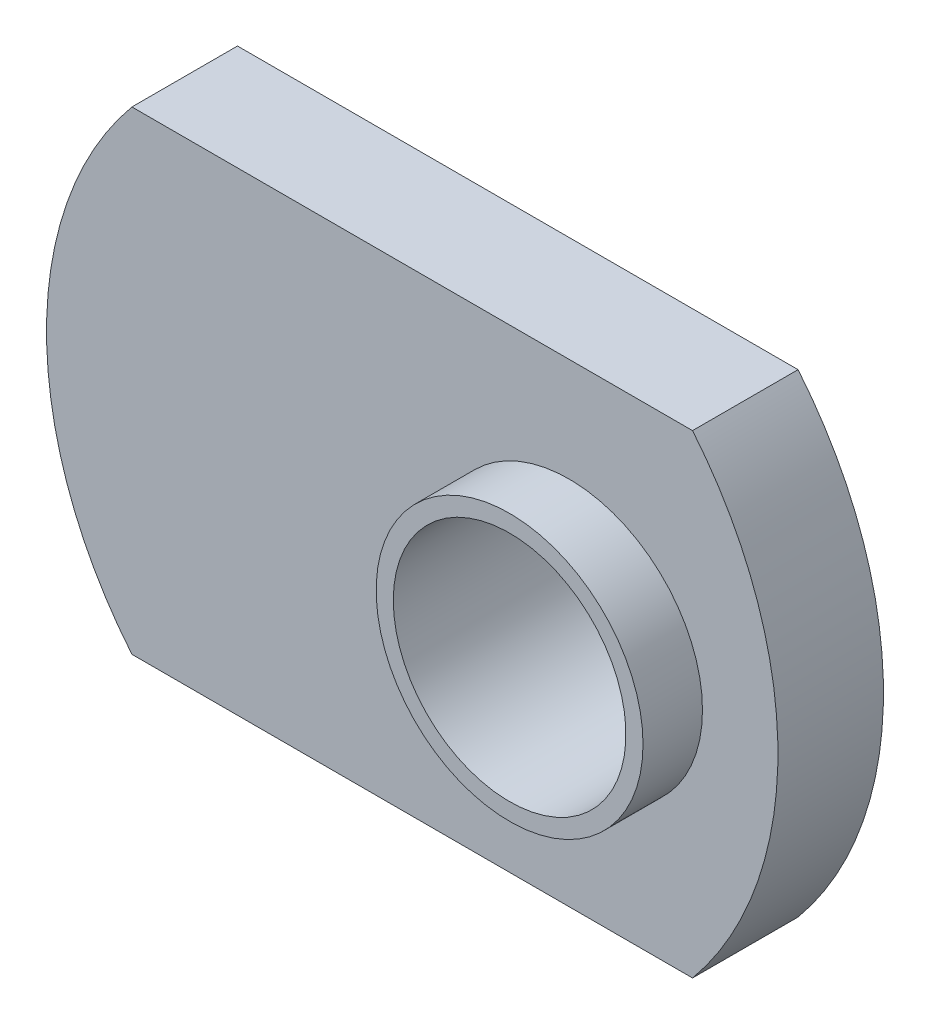
ISO-10303-21;
HEADER;
FILE_DESCRIPTION(('STEP AP214'),'2;1');
FILE_NAME('part.step','',(''),(''),'','','');
FILE_SCHEMA(('AUTOMOTIVE_DESIGN { 1 0 10303 214 1 1 1 1 }'));
ENDSEC;
DATA;
#1=APPLICATION_CONTEXT('core data for automotive mechanical design processes');
#2=APPLICATION_PROTOCOL_DEFINITION('international standard','automotive_design',2000,#1);
#3=PRODUCT_CONTEXT('',#1,'mechanical');
#4=PRODUCT('Part','Part','',(#3));
#5=PRODUCT_RELATED_PRODUCT_CATEGORY('part','',(#4));
#6=PRODUCT_DEFINITION_FORMATION('','',#4);
#7=PRODUCT_DEFINITION_CONTEXT('part definition',#1,'design');
#8=PRODUCT_DEFINITION('design','',#6,#7);
#9=PRODUCT_DEFINITION_SHAPE('','',#8);
#10=(LENGTH_UNIT() NAMED_UNIT(*) SI_UNIT(.MILLI.,.METRE.));
#11=(NAMED_UNIT(*) PLANE_ANGLE_UNIT() SI_UNIT($,.RADIAN.));
#12=(NAMED_UNIT(*) SI_UNIT($,.STERADIAN.) SOLID_ANGLE_UNIT());
#13=UNCERTAINTY_MEASURE_WITH_UNIT(LENGTH_MEASURE(1.E-05),#10,'distance_accuracy_value','');
#14=(GEOMETRIC_REPRESENTATION_CONTEXT(3) GLOBAL_UNCERTAINTY_ASSIGNED_CONTEXT((#13)) GLOBAL_UNIT_ASSIGNED_CONTEXT((#10,
#11,#12)) REPRESENTATION_CONTEXT('',''));
#15=CARTESIAN_POINT('',(0.,0.,0.));
#16=DIRECTION('',(0.,0.,1.));
#17=DIRECTION('',(1.,0.,0.));
#18=AXIS2_PLACEMENT_3D('',#15,#16,#17);
#19=CARTESIAN_POINT('',(112.122960264315,128.471327571716,3.6068));
#20=DIRECTION('',(0.,0.,1.));
#21=DIRECTION('',(1.,0.,0.));
#22=AXIS2_PLACEMENT_3D('',#19,#20,#21);
#23=PLANE('',#22);
#24=CARTESIAN_POINT('',(112.122960264315,128.471327571716,3.6068));
#25=DIRECTION('',(0.,0.,1.));
#26=DIRECTION('',(1.,0.,0.));
#27=AXIS2_PLACEMENT_3D('',#24,#25,#26);
#28=CIRCLE('',#27,12.7);
#29=CARTESIAN_POINT('',(102.34139454116,136.571387571716,3.6068));
#30=VERTEX_POINT('',#29);
#31=CARTESIAN_POINT('',(102.34139454116,120.371267571716,3.6068));
#32=VERTEX_POINT('',#31);
#33=EDGE_CURVE('E100',#30,#32,#28,.T.);
#34=ORIENTED_EDGE('',*,*,#33,.T.);
#35=DIRECTION('',(1.,0.,0.));
#36=VECTOR('',#35,1.);
#37=CARTESIAN_POINT('',(102.34139454116,120.371267571716,3.6068));
#38=LINE('',#37,#36);
#39=CARTESIAN_POINT('',(121.49812598747,120.371267571716,3.6068));
#40=VERTEX_POINT('',#39);
#41=EDGE_CURVE('E95',#32,#40,#38,.T.);
#42=ORIENTED_EDGE('',*,*,#41,.T.);
#43=CARTESIAN_POINT('',(111.716560264315,128.471327571716,3.6068));
#44=DIRECTION('',(0.,0.,1.));
#45=DIRECTION('',(1.,0.,0.));
#46=AXIS2_PLACEMENT_3D('',#43,#44,#45);
#47=CIRCLE('',#46,12.7);
#48=CARTESIAN_POINT('',(121.49812598747,136.571387571716,3.6068));
#49=VERTEX_POINT('',#48);
#50=EDGE_CURVE('E98',#40,#49,#47,.T.);
#51=ORIENTED_EDGE('',*,*,#50,.T.);
#52=DIRECTION('',(-1.,0.,0.));
#53=VECTOR('',#52,1.);
#54=CARTESIAN_POINT('',(102.34139454116,136.571387571716,3.6068));
#55=LINE('',#54,#53);
#56=EDGE_CURVE('E64',#49,#30,#55,.T.);
#57=ORIENTED_EDGE('',*,*,#56,.T.);
#58=EDGE_LOOP('',(#34,#42,#51,#57));
#59=FACE_BOUND('',#58,.T.);
#60=CARTESIAN_POINT('',(117.279160264315,128.471327571716,3.6068));
#61=DIRECTION('',(0.,0.,1.));
#62=DIRECTION('',(1.,0.,0.));
#63=AXIS2_PLACEMENT_3D('',#60,#61,#62);
#64=CIRCLE('',#63,4.5593);
#65=CARTESIAN_POINT('',(121.838460264315,128.471327571716,3.6068));
#66=VERTEX_POINT('',#65);
#67=EDGE_CURVE('E141',#66,#66,#64,.T.);
#68=ORIENTED_EDGE('',*,*,#67,.F.);
#69=EDGE_LOOP('',(#68));
#70=FACE_BOUND('',#69,.T.);
#71=ADVANCED_FACE('F46',(#59,#70),#23,.T.);
#72=CARTESIAN_POINT('',(112.122960264315,128.471327571716,3.6068));
#73=DIRECTION('',(0.,0.,-1.));
#74=DIRECTION('',(-1.,0.,0.));
#75=AXIS2_PLACEMENT_3D('',#72,#73,#74);
#76=CYLINDRICAL_SURFACE('',#75,12.7);
#77=CARTESIAN_POINT('',(112.122960264315,128.471327571716,0.));
#78=DIRECTION('',(0.,0.,1.));
#79=DIRECTION('',(1.,0.,0.));
#80=AXIS2_PLACEMENT_3D('',#77,#78,#79);
#81=CIRCLE('',#80,12.7);
#82=CARTESIAN_POINT('',(102.34139454116,136.571387571716,0.));
#83=VERTEX_POINT('',#82);
#84=CARTESIAN_POINT('',(102.34139454116,120.371267571716,0.));
#85=VERTEX_POINT('',#84);
#86=EDGE_CURVE('E119',#83,#85,#81,.T.);
#87=ORIENTED_EDGE('',*,*,#86,.T.);
#88=DIRECTION('',(0.,0.,-1.));
#89=VECTOR('',#88,1.);
#90=CARTESIAN_POINT('',(102.34139454116,120.371267571716,3.6068));
#91=LINE('',#90,#89);
#92=EDGE_CURVE('E11',#32,#85,#91,.T.);
#93=ORIENTED_EDGE('',*,*,#92,.F.);
#94=ORIENTED_EDGE('',*,*,#33,.F.);
#95=DIRECTION('',(0.,0.,-1.));
#96=VECTOR('',#95,1.);
#97=CARTESIAN_POINT('',(102.34139454116,136.571387571716,3.6068));
#98=LINE('',#97,#96);
#99=EDGE_CURVE('E115',#30,#83,#98,.T.);
#100=ORIENTED_EDGE('',*,*,#99,.T.);
#101=EDGE_LOOP('',(#87,#93,#94,#100));
#102=FACE_BOUND('',#101,.T.);
#103=ADVANCED_FACE('F48',(#102),#76,.T.);
#104=CARTESIAN_POINT('',(102.34139454116,120.371267571716,3.6068));
#105=DIRECTION('',(0.,1.,0.));
#106=DIRECTION('',(0.,0.,1.));
#107=AXIS2_PLACEMENT_3D('',#104,#105,#106);
#108=PLANE('',#107);
#109=DIRECTION('',(1.,0.,0.));
#110=VECTOR('',#109,1.);
#111=CARTESIAN_POINT('',(102.34139454116,120.371267571716,0.));
#112=LINE('',#111,#110);
#113=CARTESIAN_POINT('',(121.49812598747,120.371267571716,0.));
#114=VERTEX_POINT('',#113);
#115=EDGE_CURVE('E105',#85,#114,#112,.T.);
#116=ORIENTED_EDGE('',*,*,#115,.T.);
#117=DIRECTION('',(0.,0.,-1.));
#118=VECTOR('',#117,1.);
#119=CARTESIAN_POINT('',(121.49812598747,120.371267571716,3.6068));
#120=LINE('',#119,#118);
#121=EDGE_CURVE('E56',#40,#114,#120,.T.);
#122=ORIENTED_EDGE('',*,*,#121,.F.);
#123=ORIENTED_EDGE('',*,*,#41,.F.);
#124=ORIENTED_EDGE('',*,*,#92,.T.);
#125=EDGE_LOOP('',(#116,#122,#123,#124));
#126=FACE_BOUND('',#125,.T.);
#127=ADVANCED_FACE('F104',(#126),#108,.F.);
#128=CARTESIAN_POINT('',(111.716560264315,128.471327571716,3.6068));
#129=DIRECTION('',(0.,0.,-1.));
#130=DIRECTION('',(-1.,0.,0.));
#131=AXIS2_PLACEMENT_3D('',#128,#129,#130);
#132=CYLINDRICAL_SURFACE('',#131,12.7);
#133=CARTESIAN_POINT('',(111.716560264315,128.471327571716,0.));
#134=DIRECTION('',(0.,0.,1.));
#135=DIRECTION('',(1.,0.,0.));
#136=AXIS2_PLACEMENT_3D('',#133,#134,#135);
#137=CIRCLE('',#136,12.7);
#138=CARTESIAN_POINT('',(121.49812598747,136.571387571716,0.));
#139=VERTEX_POINT('',#138);
#140=EDGE_CURVE('E81',#114,#139,#137,.T.);
#141=ORIENTED_EDGE('',*,*,#140,.T.);
#142=DIRECTION('',(0.,0.,-1.));
#143=VECTOR('',#142,1.);
#144=CARTESIAN_POINT('',(121.49812598747,136.571387571716,3.6068));
#145=LINE('',#144,#143);
#146=EDGE_CURVE('E107',#49,#139,#145,.T.);
#147=ORIENTED_EDGE('',*,*,#146,.F.);
#148=ORIENTED_EDGE('',*,*,#50,.F.);
#149=ORIENTED_EDGE('',*,*,#121,.T.);
#150=EDGE_LOOP('',(#141,#147,#148,#149));
#151=FACE_BOUND('',#150,.T.);
#152=ADVANCED_FACE('F108',(#151),#132,.T.);
#153=CARTESIAN_POINT('',(102.34139454116,136.571387571716,3.6068));
#154=DIRECTION('',(0.,-1.,0.));
#155=DIRECTION('',(1.,0.,0.));
#156=AXIS2_PLACEMENT_3D('',#153,#154,#155);
#157=PLANE('',#156);
#158=DIRECTION('',(-1.,0.,0.));
#159=VECTOR('',#158,1.);
#160=CARTESIAN_POINT('',(102.34139454116,136.571387571716,0.));
#161=LINE('',#160,#159);
#162=EDGE_CURVE('E87',#139,#83,#161,.T.);
#163=ORIENTED_EDGE('',*,*,#162,.T.);
#164=ORIENTED_EDGE('',*,*,#99,.F.);
#165=ORIENTED_EDGE('',*,*,#56,.F.);
#166=ORIENTED_EDGE('',*,*,#146,.T.);
#167=EDGE_LOOP('',(#163,#164,#165,#166));
#168=FACE_BOUND('',#167,.T.);
#169=ADVANCED_FACE('F133',(#168),#157,.F.);
#170=CARTESIAN_POINT('',(112.122960264315,128.471327571716,0.));
#171=DIRECTION('',(0.,0.,1.));
#172=DIRECTION('',(1.,0.,0.));
#173=AXIS2_PLACEMENT_3D('',#170,#171,#172);
#174=PLANE('',#173);
#175=CARTESIAN_POINT('',(117.279160264315,128.471327571716,0.));
#176=DIRECTION('',(0.,0.,-1.));
#177=DIRECTION('',(-1.,0.,0.));
#178=AXIS2_PLACEMENT_3D('',#175,#176,#177);
#179=CIRCLE('',#178,3.97509999999999);
#180=CARTESIAN_POINT('',(113.304060264315,128.471327571716,0.));
#181=VERTEX_POINT('',#180);
#182=EDGE_CURVE('E149',#181,#181,#179,.T.);
#183=ORIENTED_EDGE('',*,*,#182,.F.);
#184=EDGE_LOOP('',(#183));
#185=FACE_BOUND('',#184,.T.);
#186=ORIENTED_EDGE('',*,*,#86,.F.);
#187=ORIENTED_EDGE('',*,*,#162,.F.);
#188=ORIENTED_EDGE('',*,*,#140,.F.);
#189=ORIENTED_EDGE('',*,*,#115,.F.);
#190=EDGE_LOOP('',(#186,#187,#188,#189));
#191=FACE_BOUND('',#190,.T.);
#192=ADVANCED_FACE('F136',(#185,#191),#174,.F.);
#193=CARTESIAN_POINT('',(117.279160264315,128.471327571716,5.6388));
#194=DIRECTION('',(0.,0.,-1.));
#195=DIRECTION('',(-1.,0.,0.));
#196=AXIS2_PLACEMENT_3D('',#193,#194,#195);
#197=CYLINDRICAL_SURFACE('',#196,4.5593);
#198=CARTESIAN_POINT('',(117.279160264315,128.471327571716,5.6388));
#199=DIRECTION('',(0.,0.,1.));
#200=DIRECTION('',(1.,0.,0.));
#201=AXIS2_PLACEMENT_3D('',#198,#199,#200);
#202=CIRCLE('',#201,4.5593);
#203=CARTESIAN_POINT('',(121.838460264315,128.471327571716,5.6388));
#204=VERTEX_POINT('',#203);
#205=EDGE_CURVE('E123',#204,#204,#202,.T.);
#206=ORIENTED_EDGE('',*,*,#205,.F.);
#207=EDGE_LOOP('',(#206));
#208=FACE_BOUND('',#207,.T.);
#209=ORIENTED_EDGE('',*,*,#67,.T.);
#210=EDGE_LOOP('',(#209));
#211=FACE_BOUND('',#210,.T.);
#212=ADVANCED_FACE('F167',(#208,#211),#197,.T.);
#213=CARTESIAN_POINT('',(117.279160264315,128.471327571716,5.6388));
#214=DIRECTION('',(0.,0.,1.));
#215=DIRECTION('',(1.,0.,0.));
#216=AXIS2_PLACEMENT_3D('',#213,#214,#215);
#217=PLANE('',#216);
#218=CARTESIAN_POINT('',(117.279160264315,128.471327571716,5.6388));
#219=DIRECTION('',(0.,0.,-1.));
#220=DIRECTION('',(-1.,0.,0.));
#221=AXIS2_PLACEMENT_3D('',#218,#219,#220);
#222=CIRCLE('',#221,3.97509999999999);
#223=CARTESIAN_POINT('',(113.304060264315,128.471327571716,5.6388));
#224=VERTEX_POINT('',#223);
#225=EDGE_CURVE('E145',#224,#224,#222,.T.);
#226=ORIENTED_EDGE('',*,*,#225,.T.);
#227=EDGE_LOOP('',(#226));
#228=FACE_BOUND('',#227,.T.);
#229=ORIENTED_EDGE('',*,*,#205,.T.);
#230=EDGE_LOOP('',(#229));
#231=FACE_BOUND('',#230,.T.);
#232=ADVANCED_FACE('F157',(#228,#231),#217,.T.);
#233=CARTESIAN_POINT('',(117.279160264315,128.471327571716,5.6388));
#234=DIRECTION('',(0.,0.,-1.));
#235=DIRECTION('',(-1.,0.,0.));
#236=AXIS2_PLACEMENT_3D('',#233,#234,#235);
#237=CYLINDRICAL_SURFACE('',#236,3.97509999999999);
#238=ORIENTED_EDGE('',*,*,#225,.F.);
#239=EDGE_LOOP('',(#238));
#240=FACE_BOUND('',#239,.T.);
#241=ORIENTED_EDGE('',*,*,#182,.T.);
#242=EDGE_LOOP('',(#241));
#243=FACE_BOUND('',#242,.T.);
#244=ADVANCED_FACE('F160',(#240,#243),#237,.F.);
#245=CLOSED_SHELL('',(#71,#103,#127,#152,#169,#192,#212,#232,#244));
#246=MANIFOLD_SOLID_BREP('B2',#245);
#247=ADVANCED_BREP_SHAPE_REPRESENTATION('',(#18,#246),#14);
#248=SHAPE_DEFINITION_REPRESENTATION(#9,#247);
ENDSEC;
END-ISO-10303-21;
